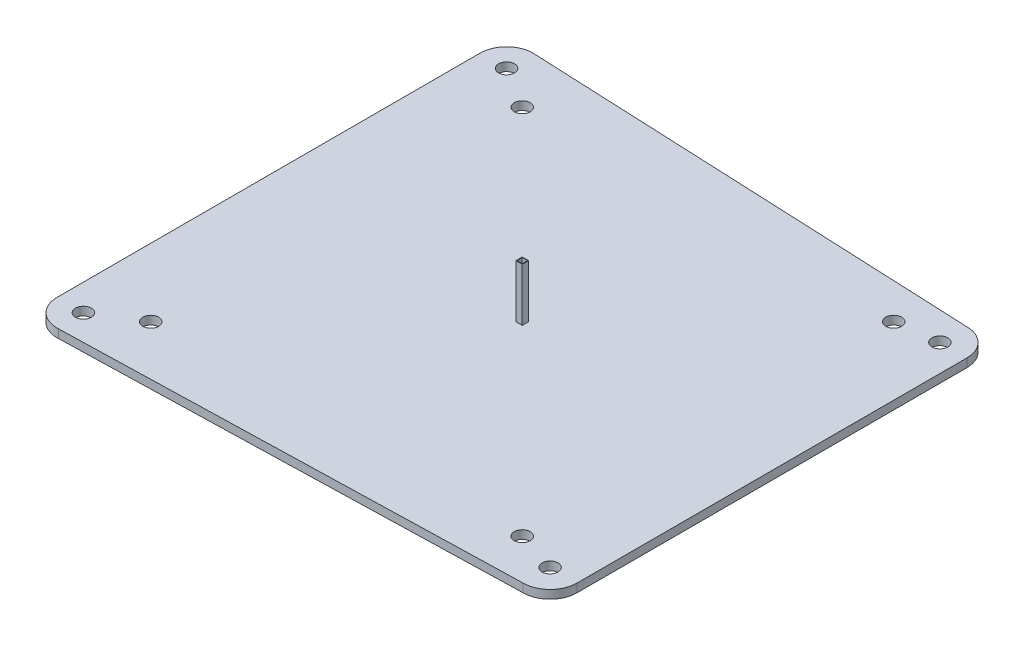
ISO-10303-21;
HEADER;
FILE_DESCRIPTION(('STEP AP214'),'2;1');
FILE_NAME('part.step','',(''),(''),'','','');
FILE_SCHEMA(('AUTOMOTIVE_DESIGN { 1 0 10303 214 1 1 1 1 }'));
ENDSEC;
DATA;
#1=APPLICATION_CONTEXT('core data for automotive mechanical design processes');
#2=APPLICATION_PROTOCOL_DEFINITION('international standard','automotive_design',2000,#1);
#3=PRODUCT_CONTEXT('',#1,'mechanical');
#4=PRODUCT('Part','Part','',(#3));
#5=PRODUCT_RELATED_PRODUCT_CATEGORY('part','',(#4));
#6=PRODUCT_DEFINITION_FORMATION('','',#4);
#7=PRODUCT_DEFINITION_CONTEXT('part definition',#1,'design');
#8=PRODUCT_DEFINITION('design','',#6,#7);
#9=PRODUCT_DEFINITION_SHAPE('','',#8);
#10=(LENGTH_UNIT() NAMED_UNIT(*) SI_UNIT(.MILLI.,.METRE.));
#11=(NAMED_UNIT(*) PLANE_ANGLE_UNIT() SI_UNIT($,.RADIAN.));
#12=(NAMED_UNIT(*) SI_UNIT($,.STERADIAN.) SOLID_ANGLE_UNIT());
#13=UNCERTAINTY_MEASURE_WITH_UNIT(LENGTH_MEASURE(1.E-05),#10,'distance_accuracy_value','');
#14=(GEOMETRIC_REPRESENTATION_CONTEXT(3) GLOBAL_UNCERTAINTY_ASSIGNED_CONTEXT((#13)) GLOBAL_UNIT_ASSIGNED_CONTEXT((#10,
#11,#12)) REPRESENTATION_CONTEXT('',''));
#15=CARTESIAN_POINT('',(0.,0.,0.));
#16=DIRECTION('',(0.,0.,1.));
#17=DIRECTION('',(1.,0.,0.));
#18=AXIS2_PLACEMENT_3D('',#15,#16,#17);
#19=CARTESIAN_POINT('',(0.,1.6,0.));
#20=DIRECTION('',(0.,-1.,0.));
#21=DIRECTION('',(0.,0.,-1.));
#22=AXIS2_PLACEMENT_3D('',#19,#20,#21);
#23=PLANE('',#22);
#24=CARTESIAN_POINT('',(-35.1,1.6,35.1));
#25=DIRECTION('',(0.,1.,0.));
#26=DIRECTION('',(0.,0.,1.));
#27=AXIS2_PLACEMENT_3D('',#24,#25,#26);
#28=CIRCLE('',#27,1.5);
#29=CARTESIAN_POINT('',(-35.1,1.6,36.6));
#30=VERTEX_POINT('',#29);
#31=EDGE_CURVE('E228',#30,#30,#28,.T.);
#32=ORIENTED_EDGE('',*,*,#31,.F.);
#33=EDGE_LOOP('',(#32));
#34=FACE_BOUND('',#33,.T.);
#35=CARTESIAN_POINT('',(35.1,1.6,35.1));
#36=DIRECTION('',(0.,1.,0.));
#37=DIRECTION('',(0.,0.,1.));
#38=AXIS2_PLACEMENT_3D('',#35,#36,#37);
#39=CIRCLE('',#38,1.5);
#40=CARTESIAN_POINT('',(35.1,1.6,36.6));
#41=VERTEX_POINT('',#40);
#42=EDGE_CURVE('E218',#41,#41,#39,.T.);
#43=ORIENTED_EDGE('',*,*,#42,.F.);
#44=EDGE_LOOP('',(#43));
#45=FACE_BOUND('',#44,.T.);
#46=CARTESIAN_POINT('',(35.1,1.6,-35.1));
#47=DIRECTION('',(0.,1.,0.));
#48=DIRECTION('',(0.,0.,1.));
#49=AXIS2_PLACEMENT_3D('',#46,#47,#48);
#50=CIRCLE('',#49,1.5);
#51=CARTESIAN_POINT('',(35.1,1.6,-33.6));
#52=VERTEX_POINT('',#51);
#53=EDGE_CURVE('E215',#52,#52,#50,.T.);
#54=ORIENTED_EDGE('',*,*,#53,.F.);
#55=EDGE_LOOP('',(#54));
#56=FACE_BOUND('',#55,.T.);
#57=CARTESIAN_POINT('',(-35.1,1.6,-35.1));
#58=DIRECTION('',(0.,1.,0.));
#59=DIRECTION('',(0.,0.,1.));
#60=AXIS2_PLACEMENT_3D('',#57,#58,#59);
#61=CIRCLE('',#60,1.5);
#62=CARTESIAN_POINT('',(-35.1,1.6,-33.6));
#63=VERTEX_POINT('',#62);
#64=EDGE_CURVE('E212',#63,#63,#61,.T.);
#65=ORIENTED_EDGE('',*,*,#64,.F.);
#66=EDGE_LOOP('',(#65));
#67=FACE_BOUND('',#66,.T.);
#68=CARTESIAN_POINT('',(-42.945,1.6,-39.985));
#69=DIRECTION('',(0.,1.,0.));
#70=DIRECTION('',(0.,0.,1.));
#71=AXIS2_PLACEMENT_3D('',#68,#69,#70);
#72=CIRCLE('',#71,1.5);
#73=CARTESIAN_POINT('',(-42.945,1.6,-38.485));
#74=VERTEX_POINT('',#73);
#75=EDGE_CURVE('E198',#74,#74,#72,.T.);
#76=ORIENTED_EDGE('',*,*,#75,.F.);
#77=EDGE_LOOP('',(#76));
#78=FACE_BOUND('',#77,.T.);
#79=CARTESIAN_POINT('',(-42.945,1.6,39.985));
#80=DIRECTION('',(0.,1.,0.));
#81=DIRECTION('',(0.,0.,1.));
#82=AXIS2_PLACEMENT_3D('',#79,#80,#81);
#83=CIRCLE('',#82,1.5);
#84=CARTESIAN_POINT('',(-42.945,1.6,41.485));
#85=VERTEX_POINT('',#84);
#86=EDGE_CURVE('E195',#85,#85,#83,.T.);
#87=ORIENTED_EDGE('',*,*,#86,.F.);
#88=EDGE_LOOP('',(#87));
#89=FACE_BOUND('',#88,.T.);
#90=CARTESIAN_POINT('',(42.845,1.6,37.585));
#91=DIRECTION('',(0.,1.,0.));
#92=DIRECTION('',(0.,0.,1.));
#93=AXIS2_PLACEMENT_3D('',#90,#91,#92);
#94=CIRCLE('',#93,1.5);
#95=CARTESIAN_POINT('',(42.845,1.6,39.085));
#96=VERTEX_POINT('',#95);
#97=EDGE_CURVE('E191',#96,#96,#94,.T.);
#98=ORIENTED_EDGE('',*,*,#97,.F.);
#99=EDGE_LOOP('',(#98));
#100=FACE_BOUND('',#99,.T.);
#101=CARTESIAN_POINT('',(42.845,1.6,-36.085));
#102=DIRECTION('',(0.,1.,0.));
#103=DIRECTION('',(0.,0.,1.));
#104=AXIS2_PLACEMENT_3D('',#101,#102,#103);
#105=CIRCLE('',#104,1.5);
#106=CARTESIAN_POINT('',(42.845,1.6,-34.585));
#107=VERTEX_POINT('',#106);
#108=EDGE_CURVE('E187',#107,#107,#105,.T.);
#109=ORIENTED_EDGE('',*,*,#108,.F.);
#110=EDGE_LOOP('',(#109));
#111=FACE_BOUND('',#110,.T.);
#112=DIRECTION('',(0.,0.,-1.));
#113=VECTOR('',#112,1.);
#114=CARTESIAN_POINT('',(0.600000000000001,1.6,0.6));
#115=LINE('',#114,#113);
#116=CARTESIAN_POINT('',(0.600000000000001,1.6,0.6));
#117=VERTEX_POINT('',#116);
#118=CARTESIAN_POINT('',(0.600000000000001,1.6,-0.6));
#119=VERTEX_POINT('',#118);
#120=EDGE_CURVE('E284',#117,#119,#115,.T.);
#121=ORIENTED_EDGE('',*,*,#120,.F.);
#122=DIRECTION('',(1.,0.,0.));
#123=VECTOR('',#122,1.);
#124=CARTESIAN_POINT('',(-0.599999999999999,1.6,0.6));
#125=LINE('',#124,#123);
#126=CARTESIAN_POINT('',(-0.599999999999999,1.6,0.6));
#127=VERTEX_POINT('',#126);
#128=EDGE_CURVE('E289',#127,#117,#125,.T.);
#129=ORIENTED_EDGE('',*,*,#128,.F.);
#130=DIRECTION('',(0.,0.,1.));
#131=VECTOR('',#130,1.);
#132=CARTESIAN_POINT('',(-0.599999999999999,1.6,0.6));
#133=LINE('',#132,#131);
#134=CARTESIAN_POINT('',(-0.599999999999999,1.6,-0.6));
#135=VERTEX_POINT('',#134);
#136=EDGE_CURVE('E301',#135,#127,#133,.T.);
#137=ORIENTED_EDGE('',*,*,#136,.F.);
#138=DIRECTION('',(-1.,0.,0.));
#139=VECTOR('',#138,1.);
#140=CARTESIAN_POINT('',(-0.599999999999999,1.6,-0.6));
#141=LINE('',#140,#139);
#142=EDGE_CURVE('E298',#119,#135,#141,.T.);
#143=ORIENTED_EDGE('',*,*,#142,.F.);
#144=EDGE_LOOP('',(#121,#129,#137,#143));
#145=FACE_BOUND('',#144,.T.);
#146=CARTESIAN_POINT('',(-42.945,1.6,-39.985));
#147=DIRECTION('',(0.,1.,0.));
#148=DIRECTION('',(0.,0.,1.));
#149=AXIS2_PLACEMENT_3D('',#146,#147,#148);
#150=CIRCLE('',#149,5.00000000000002);
#151=CARTESIAN_POINT('',(-42.5029252724991,1.6,-44.9654186506061));
#152=VERTEX_POINT('',#151);
#153=CARTESIAN_POINT('',(-47.945,1.6,-39.985));
#154=VERTEX_POINT('',#153);
#155=EDGE_CURVE('E156',#152,#154,#150,.T.);
#156=ORIENTED_EDGE('',*,*,#155,.T.);
#157=DIRECTION('',(0.,0.,1.));
#158=VECTOR('',#157,1.);
#159=CARTESIAN_POINT('',(-47.945,1.6,45.085));
#160=LINE('',#159,#158);
#161=CARTESIAN_POINT('',(-47.945,1.6,39.985));
#162=VERTEX_POINT('',#161);
#163=EDGE_CURVE('E163',#154,#162,#160,.T.);
#164=ORIENTED_EDGE('',*,*,#163,.T.);
#165=CARTESIAN_POINT('',(-42.945,1.6,39.985));
#166=DIRECTION('',(0.,1.,0.));
#167=DIRECTION('',(0.,0.,1.));
#168=AXIS2_PLACEMENT_3D('',#165,#166,#167);
#169=CIRCLE('',#168,5.);
#170=CARTESIAN_POINT('',(-42.6770960432094,1.6,44.9778175882898));
#171=VERTEX_POINT('',#170);
#172=EDGE_CURVE('E147',#162,#171,#169,.T.);
#173=ORIENTED_EDGE('',*,*,#172,.T.);
#174=DIRECTION('',(0.999640814907525,0.,-0.0268000218473834));
#175=VECTOR('',#174,1.);
#176=CARTESIAN_POINT('',(-42.6770960432094,1.6,44.9778175882898));
#177=LINE('',#176,#175);
#178=CARTESIAN_POINT('',(42.845,1.6,42.6850000000003));
#179=VERTEX_POINT('',#178);
#180=EDGE_CURVE('E155',#171,#179,#177,.T.);
#181=ORIENTED_EDGE('',*,*,#180,.T.);
#182=CARTESIAN_POINT('',(42.845,1.6,37.585));
#183=DIRECTION('',(0.,1.,0.));
#184=DIRECTION('',(0.,0.,1.));
#185=AXIS2_PLACEMENT_3D('',#182,#183,#184);
#186=CIRCLE('',#185,5.10000000000028);
#187=CARTESIAN_POINT('',(47.9450000000003,1.6,37.585));
#188=VERTEX_POINT('',#187);
#189=EDGE_CURVE('E235',#179,#188,#186,.T.);
#190=ORIENTED_EDGE('',*,*,#189,.T.);
#191=DIRECTION('',(0.,0.,-1.));
#192=VECTOR('',#191,1.);
#193=CARTESIAN_POINT('',(47.945,1.6,45.085));
#194=LINE('',#193,#192);
#195=CARTESIAN_POINT('',(47.9450000000002,1.6,-36.085));
#196=VERTEX_POINT('',#195);
#197=EDGE_CURVE('E172',#188,#196,#194,.T.);
#198=ORIENTED_EDGE('',*,*,#197,.T.);
#199=CARTESIAN_POINT('',(42.845,1.6,-36.085));
#200=DIRECTION('',(0.,1.,0.));
#201=DIRECTION('',(0.,0.,1.));
#202=AXIS2_PLACEMENT_3D('',#199,#200,#201);
#203=CIRCLE('',#202,5.10000000000022);
#204=CARTESIAN_POINT('',(42.845,1.6,-41.1850000000002));
#205=VERTEX_POINT('',#204);
#206=EDGE_CURVE('E238',#196,#205,#203,.T.);
#207=ORIENTED_EDGE('',*,*,#206,.T.);
#208=DIRECTION('',(-0.999020452773921,0.,-0.0442508185166185));
#209=VECTOR('',#208,1.);
#210=CARTESIAN_POINT('',(-42.5029252724991,1.6,-44.9654186506061));
#211=LINE('',#210,#209);
#212=EDGE_CURVE('E241',#205,#152,#211,.T.);
#213=ORIENTED_EDGE('',*,*,#212,.T.);
#214=EDGE_LOOP('',(#156,#164,#173,#181,#190,#198,#207,#213));
#215=FACE_BOUND('',#214,.T.);
#216=ADVANCED_FACE('F34',(#34,#45,#56,#67,#78,#89,#100,#111,#145,#215),#23,.F.);
#217=CARTESIAN_POINT('',(47.945,1.6,45.085));
#218=DIRECTION('',(-1.,0.,0.));
#219=DIRECTION('',(0.,0.,1.));
#220=AXIS2_PLACEMENT_3D('',#217,#218,#219);
#221=PLANE('',#220);
#222=DIRECTION('',(0.,0.,-1.));
#223=VECTOR('',#222,1.);
#224=CARTESIAN_POINT('',(47.945,0.,45.085));
#225=LINE('',#224,#223);
#226=CARTESIAN_POINT('',(47.9450000000003,0.,37.585));
#227=VERTEX_POINT('',#226);
#228=CARTESIAN_POINT('',(47.945,0.,-36.085));
#229=VERTEX_POINT('',#228);
#230=EDGE_CURVE('E180',#227,#229,#225,.T.);
#231=ORIENTED_EDGE('',*,*,#230,.T.);
#232=DIRECTION('',(0.,1.,0.));
#233=VECTOR('',#232,1.);
#234=CARTESIAN_POINT('',(47.9450000000002,-8.4,-36.085));
#235=LINE('',#234,#233);
#236=EDGE_CURVE('E59',#229,#196,#235,.T.);
#237=ORIENTED_EDGE('',*,*,#236,.T.);
#238=ORIENTED_EDGE('',*,*,#197,.F.);
#239=DIRECTION('',(0.,1.,0.));
#240=VECTOR('',#239,1.);
#241=CARTESIAN_POINT('',(47.9450000000003,-8.4,37.585));
#242=LINE('',#241,#240);
#243=EDGE_CURVE('E249',#227,#188,#242,.T.);
#244=ORIENTED_EDGE('',*,*,#243,.F.);
#245=EDGE_LOOP('',(#231,#237,#238,#244));
#246=FACE_BOUND('',#245,.T.);
#247=ADVANCED_FACE('F36',(#246),#221,.F.);
#248=CARTESIAN_POINT('',(-47.945,1.6,45.085));
#249=DIRECTION('',(1.,0.,0.));
#250=DIRECTION('',(0.,0.,-1.));
#251=AXIS2_PLACEMENT_3D('',#248,#249,#250);
#252=PLANE('',#251);
#253=DIRECTION('',(0.,1.,0.));
#254=VECTOR('',#253,1.);
#255=CARTESIAN_POINT('',(-47.945,-8.4,-39.985));
#256=LINE('',#255,#254);
#257=CARTESIAN_POINT('',(-47.945,0.,-39.985));
#258=VERTEX_POINT('',#257);
#259=EDGE_CURVE('E166',#258,#154,#256,.T.);
#260=ORIENTED_EDGE('',*,*,#259,.F.);
#261=DIRECTION('',(0.,0.,1.));
#262=VECTOR('',#261,1.);
#263=CARTESIAN_POINT('',(-47.945,0.,45.085));
#264=LINE('',#263,#262);
#265=CARTESIAN_POINT('',(-47.945,0.,39.985));
#266=VERTEX_POINT('',#265);
#267=EDGE_CURVE('E165',#258,#266,#264,.T.);
#268=ORIENTED_EDGE('',*,*,#267,.T.);
#269=DIRECTION('',(0.,1.,0.));
#270=VECTOR('',#269,1.);
#271=CARTESIAN_POINT('',(-47.945,-8.4,39.985));
#272=LINE('',#271,#270);
#273=EDGE_CURVE('E51',#266,#162,#272,.T.);
#274=ORIENTED_EDGE('',*,*,#273,.T.);
#275=ORIENTED_EDGE('',*,*,#163,.F.);
#276=EDGE_LOOP('',(#260,#268,#274,#275));
#277=FACE_BOUND('',#276,.T.);
#278=ADVANCED_FACE('F162',(#277),#252,.F.);
#279=CARTESIAN_POINT('',(0.,0.,0.));
#280=DIRECTION('',(0.,-1.,0.));
#281=DIRECTION('',(0.,0.,-1.));
#282=AXIS2_PLACEMENT_3D('',#279,#280,#281);
#283=PLANE('',#282);
#284=CARTESIAN_POINT('',(-35.1,0.,35.1));
#285=DIRECTION('',(0.,-1.,0.));
#286=DIRECTION('',(0.,0.,-1.));
#287=AXIS2_PLACEMENT_3D('',#284,#285,#286);
#288=CIRCLE('',#287,1.5);
#289=CARTESIAN_POINT('',(-35.1,0.,33.6));
#290=VERTEX_POINT('',#289);
#291=EDGE_CURVE('E38',#290,#290,#288,.T.);
#292=ORIENTED_EDGE('',*,*,#291,.F.);
#293=EDGE_LOOP('',(#292));
#294=FACE_BOUND('',#293,.T.);
#295=CARTESIAN_POINT('',(35.1,0.,35.1));
#296=DIRECTION('',(0.,-1.,0.));
#297=DIRECTION('',(0.,0.,-1.));
#298=AXIS2_PLACEMENT_3D('',#295,#296,#297);
#299=CIRCLE('',#298,1.5);
#300=CARTESIAN_POINT('',(35.1,0.,33.6));
#301=VERTEX_POINT('',#300);
#302=EDGE_CURVE('E216',#301,#301,#299,.T.);
#303=ORIENTED_EDGE('',*,*,#302,.F.);
#304=EDGE_LOOP('',(#303));
#305=FACE_BOUND('',#304,.T.);
#306=CARTESIAN_POINT('',(35.1,0.,-35.1));
#307=DIRECTION('',(0.,-1.,0.));
#308=DIRECTION('',(0.,0.,-1.));
#309=AXIS2_PLACEMENT_3D('',#306,#307,#308);
#310=CIRCLE('',#309,1.5);
#311=CARTESIAN_POINT('',(35.1,0.,-36.6));
#312=VERTEX_POINT('',#311);
#313=EDGE_CURVE('E213',#312,#312,#310,.T.);
#314=ORIENTED_EDGE('',*,*,#313,.F.);
#315=EDGE_LOOP('',(#314));
#316=FACE_BOUND('',#315,.T.);
#317=CARTESIAN_POINT('',(-35.1,0.,-35.1));
#318=DIRECTION('',(0.,-1.,0.));
#319=DIRECTION('',(0.,0.,-1.));
#320=AXIS2_PLACEMENT_3D('',#317,#318,#319);
#321=CIRCLE('',#320,1.5);
#322=CARTESIAN_POINT('',(-35.1,0.,-36.6));
#323=VERTEX_POINT('',#322);
#324=EDGE_CURVE('E209',#323,#323,#321,.T.);
#325=ORIENTED_EDGE('',*,*,#324,.F.);
#326=EDGE_LOOP('',(#325));
#327=FACE_BOUND('',#326,.T.);
#328=CARTESIAN_POINT('',(-42.945,0.,-39.985));
#329=DIRECTION('',(0.,-1.,0.));
#330=DIRECTION('',(0.,0.,-1.));
#331=AXIS2_PLACEMENT_3D('',#328,#329,#330);
#332=CIRCLE('',#331,1.5);
#333=CARTESIAN_POINT('',(-42.945,0.,-41.485));
#334=VERTEX_POINT('',#333);
#335=EDGE_CURVE('E196',#334,#334,#332,.T.);
#336=ORIENTED_EDGE('',*,*,#335,.F.);
#337=EDGE_LOOP('',(#336));
#338=FACE_BOUND('',#337,.T.);
#339=CARTESIAN_POINT('',(-42.945,0.,39.985));
#340=DIRECTION('',(0.,-1.,0.));
#341=DIRECTION('',(0.,0.,-1.));
#342=AXIS2_PLACEMENT_3D('',#339,#340,#341);
#343=CIRCLE('',#342,1.5);
#344=CARTESIAN_POINT('',(-42.945,0.,38.485));
#345=VERTEX_POINT('',#344);
#346=EDGE_CURVE('E192',#345,#345,#343,.T.);
#347=ORIENTED_EDGE('',*,*,#346,.F.);
#348=EDGE_LOOP('',(#347));
#349=FACE_BOUND('',#348,.T.);
#350=CARTESIAN_POINT('',(42.845,0.,37.585));
#351=DIRECTION('',(0.,-1.,0.));
#352=DIRECTION('',(0.,0.,-1.));
#353=AXIS2_PLACEMENT_3D('',#350,#351,#352);
#354=CIRCLE('',#353,1.5);
#355=CARTESIAN_POINT('',(42.845,0.,36.085));
#356=VERTEX_POINT('',#355);
#357=EDGE_CURVE('E188',#356,#356,#354,.T.);
#358=ORIENTED_EDGE('',*,*,#357,.F.);
#359=EDGE_LOOP('',(#358));
#360=FACE_BOUND('',#359,.T.);
#361=CARTESIAN_POINT('',(42.845,0.,-36.085));
#362=DIRECTION('',(0.,-1.,0.));
#363=DIRECTION('',(0.,0.,-1.));
#364=AXIS2_PLACEMENT_3D('',#361,#362,#363);
#365=CIRCLE('',#364,1.5);
#366=CARTESIAN_POINT('',(42.845,0.,-37.585));
#367=VERTEX_POINT('',#366);
#368=EDGE_CURVE('E183',#367,#367,#365,.T.);
#369=ORIENTED_EDGE('',*,*,#368,.F.);
#370=EDGE_LOOP('',(#369));
#371=FACE_BOUND('',#370,.T.);
#372=ORIENTED_EDGE('',*,*,#267,.F.);
#373=CARTESIAN_POINT('',(-42.945,0.,-39.985));
#374=DIRECTION('',(0.,-1.,0.));
#375=DIRECTION('',(0.,0.,-1.));
#376=AXIS2_PLACEMENT_3D('',#373,#374,#375);
#377=CIRCLE('',#376,5.00000000000002);
#378=CARTESIAN_POINT('',(-42.5029252724991,0.,-44.9654186506061));
#379=VERTEX_POINT('',#378);
#380=EDGE_CURVE('E12',#258,#379,#377,.T.);
#381=ORIENTED_EDGE('',*,*,#380,.T.);
#382=DIRECTION('',(0.999020452773921,0.,0.0442508185166185));
#383=VECTOR('',#382,1.);
#384=CARTESIAN_POINT('',(1.90458105669061,0.,-42.998423382499));
#385=LINE('',#384,#383);
#386=CARTESIAN_POINT('',(42.845,0.,-41.1850000000002));
#387=VERTEX_POINT('',#386);
#388=EDGE_CURVE('E43',#379,#387,#385,.T.);
#389=ORIENTED_EDGE('',*,*,#388,.T.);
#390=CARTESIAN_POINT('',(42.845,0.,-36.085));
#391=DIRECTION('',(0.,-1.,0.));
#392=DIRECTION('',(0.,0.,-1.));
#393=AXIS2_PLACEMENT_3D('',#390,#391,#392);
#394=CIRCLE('',#393,5.10000000000022);
#395=EDGE_CURVE('E205',#387,#229,#394,.T.);
#396=ORIENTED_EDGE('',*,*,#395,.T.);
#397=ORIENTED_EDGE('',*,*,#230,.F.);
#398=CARTESIAN_POINT('',(42.845,0.,37.585));
#399=DIRECTION('',(0.,-1.,0.));
#400=DIRECTION('',(0.,0.,-1.));
#401=AXIS2_PLACEMENT_3D('',#398,#399,#400);
#402=CIRCLE('',#401,5.10000000000028);
#403=CARTESIAN_POINT('',(42.845,0.,42.6850000000003));
#404=VERTEX_POINT('',#403);
#405=EDGE_CURVE('E202',#227,#404,#402,.T.);
#406=ORIENTED_EDGE('',*,*,#405,.T.);
#407=DIRECTION('',(-0.999640814907525,0.,0.0268000218473834));
#408=VECTOR('',#407,1.);
#409=CARTESIAN_POINT('',(1.17432108253295,0.,43.8021763784845));
#410=LINE('',#409,#408);
#411=CARTESIAN_POINT('',(-42.6770960432094,0.,44.9778175882898));
#412=VERTEX_POINT('',#411);
#413=EDGE_CURVE('E174',#404,#412,#410,.T.);
#414=ORIENTED_EDGE('',*,*,#413,.T.);
#415=CARTESIAN_POINT('',(-42.945,0.,39.985));
#416=DIRECTION('',(0.,-1.,0.));
#417=DIRECTION('',(0.,0.,-1.));
#418=AXIS2_PLACEMENT_3D('',#415,#416,#417);
#419=CIRCLE('',#418,5.);
#420=EDGE_CURVE('E171',#412,#266,#419,.T.);
#421=ORIENTED_EDGE('',*,*,#420,.T.);
#422=EDGE_LOOP('',(#372,#381,#389,#396,#397,#406,#414,#421));
#423=FACE_BOUND('',#422,.T.);
#424=ADVANCED_FACE('F373',(#294,#305,#316,#327,#338,#349,#360,#371,#423),#283,.T.);
#425=CARTESIAN_POINT('',(42.845,-8.4,-36.085));
#426=DIRECTION('',(0.,1.,0.));
#427=DIRECTION('',(0.,0.,1.));
#428=AXIS2_PLACEMENT_3D('',#425,#426,#427);
#429=CYLINDRICAL_SURFACE('',#428,1.5);
#430=ORIENTED_EDGE('',*,*,#368,.T.);
#431=EDGE_LOOP('',(#430));
#432=FACE_BOUND('',#431,.T.);
#433=ORIENTED_EDGE('',*,*,#108,.T.);
#434=EDGE_LOOP('',(#433));
#435=FACE_BOUND('',#434,.T.);
#436=ADVANCED_FACE('F325',(#432,#435),#429,.F.);
#437=CARTESIAN_POINT('',(42.845,-8.4,37.585));
#438=DIRECTION('',(0.,1.,0.));
#439=DIRECTION('',(0.,0.,1.));
#440=AXIS2_PLACEMENT_3D('',#437,#438,#439);
#441=CYLINDRICAL_SURFACE('',#440,1.5);
#442=ORIENTED_EDGE('',*,*,#357,.T.);
#443=EDGE_LOOP('',(#442));
#444=FACE_BOUND('',#443,.T.);
#445=ORIENTED_EDGE('',*,*,#97,.T.);
#446=EDGE_LOOP('',(#445));
#447=FACE_BOUND('',#446,.T.);
#448=ADVANCED_FACE('F367',(#444,#447),#441,.F.);
#449=CARTESIAN_POINT('',(-42.945,-8.4,39.985));
#450=DIRECTION('',(0.,1.,0.));
#451=DIRECTION('',(0.,0.,1.));
#452=AXIS2_PLACEMENT_3D('',#449,#450,#451);
#453=CYLINDRICAL_SURFACE('',#452,1.5);
#454=ORIENTED_EDGE('',*,*,#346,.T.);
#455=EDGE_LOOP('',(#454));
#456=FACE_BOUND('',#455,.T.);
#457=ORIENTED_EDGE('',*,*,#86,.T.);
#458=EDGE_LOOP('',(#457));
#459=FACE_BOUND('',#458,.T.);
#460=ADVANCED_FACE('F363',(#456,#459),#453,.F.);
#461=CARTESIAN_POINT('',(-42.945,-8.4,-39.985));
#462=DIRECTION('',(0.,1.,0.));
#463=DIRECTION('',(0.,0.,1.));
#464=AXIS2_PLACEMENT_3D('',#461,#462,#463);
#465=CYLINDRICAL_SURFACE('',#464,1.5);
#466=ORIENTED_EDGE('',*,*,#335,.T.);
#467=EDGE_LOOP('',(#466));
#468=FACE_BOUND('',#467,.T.);
#469=ORIENTED_EDGE('',*,*,#75,.T.);
#470=EDGE_LOOP('',(#469));
#471=FACE_BOUND('',#470,.T.);
#472=ADVANCED_FACE('F360',(#468,#471),#465,.F.);
#473=CARTESIAN_POINT('',(0.,11.6,0.));
#474=DIRECTION('',(0.,-1.,0.));
#475=DIRECTION('',(0.,0.,-1.));
#476=AXIS2_PLACEMENT_3D('',#473,#474,#475);
#477=PLANE('',#476);
#478=DIRECTION('',(0.,0.,-1.));
#479=VECTOR('',#478,1.);
#480=CARTESIAN_POINT('',(0.600000000000001,11.6,0.6));
#481=LINE('',#480,#479);
#482=CARTESIAN_POINT('',(0.600000000000001,11.6,0.6));
#483=VERTEX_POINT('',#482);
#484=CARTESIAN_POINT('',(0.600000000000001,11.6,-0.6));
#485=VERTEX_POINT('',#484);
#486=EDGE_CURVE('E285',#483,#485,#481,.T.);
#487=ORIENTED_EDGE('',*,*,#486,.T.);
#488=DIRECTION('',(-1.,0.,0.));
#489=VECTOR('',#488,1.);
#490=CARTESIAN_POINT('',(-0.599999999999999,11.6,-0.6));
#491=LINE('',#490,#489);
#492=CARTESIAN_POINT('',(-0.599999999999999,11.6,-0.6));
#493=VERTEX_POINT('',#492);
#494=EDGE_CURVE('E288',#485,#493,#491,.T.);
#495=ORIENTED_EDGE('',*,*,#494,.T.);
#496=DIRECTION('',(0.,0.,1.));
#497=VECTOR('',#496,1.);
#498=CARTESIAN_POINT('',(-0.599999999999999,11.6,0.6));
#499=LINE('',#498,#497);
#500=CARTESIAN_POINT('',(-0.599999999999999,11.6,0.6));
#501=VERTEX_POINT('',#500);
#502=EDGE_CURVE('E291',#493,#501,#499,.T.);
#503=ORIENTED_EDGE('',*,*,#502,.T.);
#504=DIRECTION('',(1.,0.,0.));
#505=VECTOR('',#504,1.);
#506=CARTESIAN_POINT('',(-0.599999999999999,11.6,0.6));
#507=LINE('',#506,#505);
#508=EDGE_CURVE('E293',#501,#483,#507,.T.);
#509=ORIENTED_EDGE('',*,*,#508,.T.);
#510=EDGE_LOOP('',(#487,#495,#503,#509));
#511=FACE_BOUND('',#510,.T.);
#512=DIRECTION('',(0.,0.,-1.));
#513=VECTOR('',#512,1.);
#514=CARTESIAN_POINT('',(0.5,11.6,0.5));
#515=LINE('',#514,#513);
#516=CARTESIAN_POINT('',(0.5,11.6,0.5));
#517=VERTEX_POINT('',#516);
#518=CARTESIAN_POINT('',(0.5,11.6,-0.5));
#519=VERTEX_POINT('',#518);
#520=EDGE_CURVE('E255',#517,#519,#515,.T.);
#521=ORIENTED_EDGE('',*,*,#520,.F.);
#522=DIRECTION('',(1.,0.,0.));
#523=VECTOR('',#522,1.);
#524=CARTESIAN_POINT('',(-0.5,11.6,0.5));
#525=LINE('',#524,#523);
#526=CARTESIAN_POINT('',(-0.5,11.6,0.5));
#527=VERTEX_POINT('',#526);
#528=EDGE_CURVE('E263',#527,#517,#525,.T.);
#529=ORIENTED_EDGE('',*,*,#528,.F.);
#530=DIRECTION('',(0.,0.,1.));
#531=VECTOR('',#530,1.);
#532=CARTESIAN_POINT('',(-0.5,11.6,0.5));
#533=LINE('',#532,#531);
#534=CARTESIAN_POINT('',(-0.5,11.6,-0.5));
#535=VERTEX_POINT('',#534);
#536=EDGE_CURVE('E260',#535,#527,#533,.T.);
#537=ORIENTED_EDGE('',*,*,#536,.F.);
#538=DIRECTION('',(-1.,0.,0.));
#539=VECTOR('',#538,1.);
#540=CARTESIAN_POINT('',(-0.5,11.6,-0.5));
#541=LINE('',#540,#539);
#542=EDGE_CURVE('E257',#519,#535,#541,.T.);
#543=ORIENTED_EDGE('',*,*,#542,.F.);
#544=EDGE_LOOP('',(#521,#529,#537,#543));
#545=FACE_BOUND('',#544,.T.);
#546=ADVANCED_FACE('F342',(#511,#545),#477,.F.);
#547=CARTESIAN_POINT('',(0.600000000000001,11.6,0.6));
#548=DIRECTION('',(-1.,0.,0.));
#549=DIRECTION('',(0.,0.,1.));
#550=AXIS2_PLACEMENT_3D('',#547,#548,#549);
#551=PLANE('',#550);
#552=ORIENTED_EDGE('',*,*,#120,.T.);
#553=DIRECTION('',(0.,-1.,0.));
#554=VECTOR('',#553,1.);
#555=CARTESIAN_POINT('',(0.600000000000001,11.6,-0.6));
#556=LINE('',#555,#554);
#557=EDGE_CURVE('E314',#485,#119,#556,.T.);
#558=ORIENTED_EDGE('',*,*,#557,.F.);
#559=ORIENTED_EDGE('',*,*,#486,.F.);
#560=DIRECTION('',(0.,-1.,0.));
#561=VECTOR('',#560,1.);
#562=CARTESIAN_POINT('',(0.600000000000001,11.6,0.6));
#563=LINE('',#562,#561);
#564=EDGE_CURVE('E295',#483,#117,#563,.T.);
#565=ORIENTED_EDGE('',*,*,#564,.T.);
#566=EDGE_LOOP('',(#552,#558,#559,#565));
#567=FACE_BOUND('',#566,.T.);
#568=ADVANCED_FACE('F340',(#567),#551,.F.);
#569=CARTESIAN_POINT('',(-0.599999999999999,11.6,-0.6));
#570=DIRECTION('',(0.,0.,1.));
#571=DIRECTION('',(1.,0.,0.));
#572=AXIS2_PLACEMENT_3D('',#569,#570,#571);
#573=PLANE('',#572);
#574=ORIENTED_EDGE('',*,*,#142,.T.);
#575=DIRECTION('',(0.,-1.,0.));
#576=VECTOR('',#575,1.);
#577=CARTESIAN_POINT('',(-0.599999999999999,11.6,-0.6));
#578=LINE('',#577,#576);
#579=EDGE_CURVE('E311',#493,#135,#578,.T.);
#580=ORIENTED_EDGE('',*,*,#579,.F.);
#581=ORIENTED_EDGE('',*,*,#494,.F.);
#582=ORIENTED_EDGE('',*,*,#557,.T.);
#583=EDGE_LOOP('',(#574,#580,#581,#582));
#584=FACE_BOUND('',#583,.T.);
#585=ADVANCED_FACE('F349',(#584),#573,.F.);
#586=CARTESIAN_POINT('',(-0.599999999999999,11.6,0.6));
#587=DIRECTION('',(1.,0.,0.));
#588=DIRECTION('',(0.,0.,-1.));
#589=AXIS2_PLACEMENT_3D('',#586,#587,#588);
#590=PLANE('',#589);
#591=ORIENTED_EDGE('',*,*,#136,.T.);
#592=DIRECTION('',(0.,-1.,0.));
#593=VECTOR('',#592,1.);
#594=CARTESIAN_POINT('',(-0.599999999999999,11.6,0.6));
#595=LINE('',#594,#593);
#596=EDGE_CURVE('E308',#501,#127,#595,.T.);
#597=ORIENTED_EDGE('',*,*,#596,.F.);
#598=ORIENTED_EDGE('',*,*,#502,.F.);
#599=ORIENTED_EDGE('',*,*,#579,.T.);
#600=EDGE_LOOP('',(#591,#597,#598,#599));
#601=FACE_BOUND('',#600,.T.);
#602=ADVANCED_FACE('F347',(#601),#590,.F.);
#603=CARTESIAN_POINT('',(-0.599999999999999,11.6,0.6));
#604=DIRECTION('',(0.,0.,-1.));
#605=DIRECTION('',(-1.,0.,0.));
#606=AXIS2_PLACEMENT_3D('',#603,#604,#605);
#607=PLANE('',#606);
#608=ORIENTED_EDGE('',*,*,#128,.T.);
#609=ORIENTED_EDGE('',*,*,#564,.F.);
#610=ORIENTED_EDGE('',*,*,#508,.F.);
#611=ORIENTED_EDGE('',*,*,#596,.T.);
#612=EDGE_LOOP('',(#608,#609,#610,#611));
#613=FACE_BOUND('',#612,.T.);
#614=ADVANCED_FACE('F336',(#613),#607,.F.);
#615=CARTESIAN_POINT('',(0.5,11.6,0.5));
#616=DIRECTION('',(-1.,0.,0.));
#617=DIRECTION('',(0.,0.,1.));
#618=AXIS2_PLACEMENT_3D('',#615,#616,#617);
#619=PLANE('',#618);
#620=DIRECTION('',(0.,0.,-1.));
#621=VECTOR('',#620,1.);
#622=CARTESIAN_POINT('',(0.5,1.6,0.5));
#623=LINE('',#622,#621);
#624=CARTESIAN_POINT('',(0.5,1.6,0.5));
#625=VERTEX_POINT('',#624);
#626=CARTESIAN_POINT('',(0.5,1.6,-0.5));
#627=VERTEX_POINT('',#626);
#628=EDGE_CURVE('E245',#625,#627,#623,.T.);
#629=ORIENTED_EDGE('',*,*,#628,.F.);
#630=DIRECTION('',(0.,-1.,0.));
#631=VECTOR('',#630,1.);
#632=CARTESIAN_POINT('',(0.5,11.6,0.5));
#633=LINE('',#632,#631);
#634=EDGE_CURVE('E265',#517,#625,#633,.T.);
#635=ORIENTED_EDGE('',*,*,#634,.F.);
#636=ORIENTED_EDGE('',*,*,#520,.T.);
#637=DIRECTION('',(0.,-1.,0.));
#638=VECTOR('',#637,1.);
#639=CARTESIAN_POINT('',(0.5,11.6,-0.5));
#640=LINE('',#639,#638);
#641=EDGE_CURVE('E281',#519,#627,#640,.T.);
#642=ORIENTED_EDGE('',*,*,#641,.T.);
#643=EDGE_LOOP('',(#629,#635,#636,#642));
#644=FACE_BOUND('',#643,.T.);
#645=ADVANCED_FACE('F429',(#644),#619,.T.);
#646=CARTESIAN_POINT('',(-0.5,11.6,-0.5));
#647=DIRECTION('',(0.,0.,1.));
#648=DIRECTION('',(1.,0.,0.));
#649=AXIS2_PLACEMENT_3D('',#646,#647,#648);
#650=PLANE('',#649);
#651=DIRECTION('',(-1.,0.,0.));
#652=VECTOR('',#651,1.);
#653=CARTESIAN_POINT('',(-0.5,1.6,-0.5));
#654=LINE('',#653,#652);
#655=CARTESIAN_POINT('',(-0.5,1.6,-0.5));
#656=VERTEX_POINT('',#655);
#657=EDGE_CURVE('E268',#627,#656,#654,.T.);
#658=ORIENTED_EDGE('',*,*,#657,.F.);
#659=ORIENTED_EDGE('',*,*,#641,.F.);
#660=ORIENTED_EDGE('',*,*,#542,.T.);
#661=DIRECTION('',(0.,-1.,0.));
#662=VECTOR('',#661,1.);
#663=CARTESIAN_POINT('',(-0.5,11.6,-0.5));
#664=LINE('',#663,#662);
#665=EDGE_CURVE('E279',#535,#656,#664,.T.);
#666=ORIENTED_EDGE('',*,*,#665,.T.);
#667=EDGE_LOOP('',(#658,#659,#660,#666));
#668=FACE_BOUND('',#667,.T.);
#669=ADVANCED_FACE('F425',(#668),#650,.T.);
#670=CARTESIAN_POINT('',(-0.5,11.6,0.5));
#671=DIRECTION('',(1.,0.,0.));
#672=DIRECTION('',(0.,0.,-1.));
#673=AXIS2_PLACEMENT_3D('',#670,#671,#672);
#674=PLANE('',#673);
#675=DIRECTION('',(0.,0.,1.));
#676=VECTOR('',#675,1.);
#677=CARTESIAN_POINT('',(-0.5,1.6,0.5));
#678=LINE('',#677,#676);
#679=CARTESIAN_POINT('',(-0.5,1.6,0.5));
#680=VERTEX_POINT('',#679);
#681=EDGE_CURVE('E271',#656,#680,#678,.T.);
#682=ORIENTED_EDGE('',*,*,#681,.F.);
#683=ORIENTED_EDGE('',*,*,#665,.F.);
#684=ORIENTED_EDGE('',*,*,#536,.T.);
#685=DIRECTION('',(0.,-1.,0.));
#686=VECTOR('',#685,1.);
#687=CARTESIAN_POINT('',(-0.5,11.6,0.5));
#688=LINE('',#687,#686);
#689=EDGE_CURVE('E277',#527,#680,#688,.T.);
#690=ORIENTED_EDGE('',*,*,#689,.T.);
#691=EDGE_LOOP('',(#682,#683,#684,#690));
#692=FACE_BOUND('',#691,.T.);
#693=ADVANCED_FACE('F421',(#692),#674,.T.);
#694=CARTESIAN_POINT('',(-0.5,11.6,0.5));
#695=DIRECTION('',(0.,0.,-1.));
#696=DIRECTION('',(-1.,0.,0.));
#697=AXIS2_PLACEMENT_3D('',#694,#695,#696);
#698=PLANE('',#697);
#699=DIRECTION('',(1.,0.,0.));
#700=VECTOR('',#699,1.);
#701=CARTESIAN_POINT('',(-0.5,1.6,0.5));
#702=LINE('',#701,#700);
#703=EDGE_CURVE('E258',#680,#625,#702,.T.);
#704=ORIENTED_EDGE('',*,*,#703,.F.);
#705=ORIENTED_EDGE('',*,*,#689,.F.);
#706=ORIENTED_EDGE('',*,*,#528,.T.);
#707=ORIENTED_EDGE('',*,*,#634,.T.);
#708=EDGE_LOOP('',(#704,#705,#706,#707));
#709=FACE_BOUND('',#708,.T.);
#710=ADVANCED_FACE('F377',(#709),#698,.T.);
#711=ORIENTED_EDGE('',*,*,#703,.T.);
#712=ORIENTED_EDGE('',*,*,#628,.T.);
#713=ORIENTED_EDGE('',*,*,#657,.T.);
#714=ORIENTED_EDGE('',*,*,#681,.T.);
#715=EDGE_LOOP('',(#711,#712,#713,#714));
#716=FACE_BOUND('',#715,.T.);
#717=ADVANCED_FACE('F331',(#716),#23,.F.);
#718=CARTESIAN_POINT('',(-42.945,-8.4,39.985));
#719=DIRECTION('',(0.,1.,0.));
#720=DIRECTION('',(0.,0.,1.));
#721=AXIS2_PLACEMENT_3D('',#718,#719,#720);
#722=CYLINDRICAL_SURFACE('',#721,5.);
#723=DIRECTION('',(0.,1.,0.));
#724=VECTOR('',#723,1.);
#725=CARTESIAN_POINT('',(-42.6770960432094,-8.4,44.9778175882898));
#726=LINE('',#725,#724);
#727=EDGE_CURVE('E150',#412,#171,#726,.T.);
#728=ORIENTED_EDGE('',*,*,#727,.T.);
#729=ORIENTED_EDGE('',*,*,#172,.F.);
#730=ORIENTED_EDGE('',*,*,#273,.F.);
#731=ORIENTED_EDGE('',*,*,#420,.F.);
#732=EDGE_LOOP('',(#728,#729,#730,#731));
#733=FACE_BOUND('',#732,.T.);
#734=ADVANCED_FACE('F148',(#733),#722,.T.);
#735=CARTESIAN_POINT('',(-42.6770960432094,-8.4,44.9778175882898));
#736=DIRECTION('',(0.0268000218473834,0.,0.999640814907525));
#737=DIRECTION('',(0.999640814907525,0.,-0.0268000218473834));
#738=AXIS2_PLACEMENT_3D('',#735,#736,#737);
#739=PLANE('',#738);
#740=DIRECTION('',(0.,1.,0.));
#741=VECTOR('',#740,1.);
#742=CARTESIAN_POINT('',(42.845,-8.4,42.6850000000003));
#743=LINE('',#742,#741);
#744=EDGE_CURVE('E251',#404,#179,#743,.T.);
#745=ORIENTED_EDGE('',*,*,#744,.T.);
#746=ORIENTED_EDGE('',*,*,#180,.F.);
#747=ORIENTED_EDGE('',*,*,#727,.F.);
#748=ORIENTED_EDGE('',*,*,#413,.F.);
#749=EDGE_LOOP('',(#745,#746,#747,#748));
#750=FACE_BOUND('',#749,.T.);
#751=ADVANCED_FACE('F405',(#750),#739,.T.);
#752=CARTESIAN_POINT('',(42.845,-8.4,37.585));
#753=DIRECTION('',(0.,1.,0.));
#754=DIRECTION('',(0.,0.,1.));
#755=AXIS2_PLACEMENT_3D('',#752,#753,#754);
#756=CYLINDRICAL_SURFACE('',#755,5.10000000000028);
#757=ORIENTED_EDGE('',*,*,#243,.T.);
#758=ORIENTED_EDGE('',*,*,#189,.F.);
#759=ORIENTED_EDGE('',*,*,#744,.F.);
#760=ORIENTED_EDGE('',*,*,#405,.F.);
#761=EDGE_LOOP('',(#757,#758,#759,#760));
#762=FACE_BOUND('',#761,.T.);
#763=ADVANCED_FACE('F403',(#762),#756,.T.);
#764=CARTESIAN_POINT('',(-42.945,-8.4,-39.985));
#765=DIRECTION('',(0.,1.,0.));
#766=DIRECTION('',(0.,0.,1.));
#767=AXIS2_PLACEMENT_3D('',#764,#765,#766);
#768=CYLINDRICAL_SURFACE('',#767,5.00000000000002);
#769=ORIENTED_EDGE('',*,*,#259,.T.);
#770=ORIENTED_EDGE('',*,*,#155,.F.);
#771=DIRECTION('',(0.,1.,0.));
#772=VECTOR('',#771,1.);
#773=CARTESIAN_POINT('',(-42.5029252724991,-8.4,-44.9654186506061));
#774=LINE('',#773,#772);
#775=EDGE_CURVE('E243',#379,#152,#774,.T.);
#776=ORIENTED_EDGE('',*,*,#775,.F.);
#777=ORIENTED_EDGE('',*,*,#380,.F.);
#778=EDGE_LOOP('',(#769,#770,#776,#777));
#779=FACE_BOUND('',#778,.T.);
#780=ADVANCED_FACE('F407',(#779),#768,.T.);
#781=CARTESIAN_POINT('',(-42.5029252724991,-8.4,-44.9654186506061));
#782=DIRECTION('',(0.0442508185166185,0.,-0.999020452773921));
#783=DIRECTION('',(-0.999020452773921,0.,-0.0442508185166185));
#784=AXIS2_PLACEMENT_3D('',#781,#782,#783);
#785=PLANE('',#784);
#786=ORIENTED_EDGE('',*,*,#775,.T.);
#787=ORIENTED_EDGE('',*,*,#212,.F.);
#788=DIRECTION('',(0.,1.,0.));
#789=VECTOR('',#788,1.);
#790=CARTESIAN_POINT('',(42.845,-8.4,-41.1850000000002));
#791=LINE('',#790,#789);
#792=EDGE_CURVE('E246',#387,#205,#791,.T.);
#793=ORIENTED_EDGE('',*,*,#792,.F.);
#794=ORIENTED_EDGE('',*,*,#388,.F.);
#795=EDGE_LOOP('',(#786,#787,#793,#794));
#796=FACE_BOUND('',#795,.T.);
#797=ADVANCED_FACE('F398',(#796),#785,.T.);
#798=CARTESIAN_POINT('',(42.845,-8.4,-36.085));
#799=DIRECTION('',(0.,1.,0.));
#800=DIRECTION('',(0.,0.,1.));
#801=AXIS2_PLACEMENT_3D('',#798,#799,#800);
#802=CYLINDRICAL_SURFACE('',#801,5.10000000000022);
#803=ORIENTED_EDGE('',*,*,#792,.T.);
#804=ORIENTED_EDGE('',*,*,#206,.F.);
#805=ORIENTED_EDGE('',*,*,#236,.F.);
#806=ORIENTED_EDGE('',*,*,#395,.F.);
#807=EDGE_LOOP('',(#803,#804,#805,#806));
#808=FACE_BOUND('',#807,.T.);
#809=ADVANCED_FACE('F395',(#808),#802,.T.);
#810=CARTESIAN_POINT('',(-35.1,-8.4,-35.1));
#811=DIRECTION('',(0.,1.,0.));
#812=DIRECTION('',(0.,0.,1.));
#813=AXIS2_PLACEMENT_3D('',#810,#811,#812);
#814=CYLINDRICAL_SURFACE('',#813,1.5);
#815=ORIENTED_EDGE('',*,*,#324,.T.);
#816=EDGE_LOOP('',(#815));
#817=FACE_BOUND('',#816,.T.);
#818=ORIENTED_EDGE('',*,*,#64,.T.);
#819=EDGE_LOOP('',(#818));
#820=FACE_BOUND('',#819,.T.);
#821=ADVANCED_FACE('F492',(#817,#820),#814,.F.);
#822=CARTESIAN_POINT('',(35.1,-8.4,-35.1));
#823=DIRECTION('',(0.,1.,0.));
#824=DIRECTION('',(0.,0.,1.));
#825=AXIS2_PLACEMENT_3D('',#822,#823,#824);
#826=CYLINDRICAL_SURFACE('',#825,1.5);
#827=ORIENTED_EDGE('',*,*,#313,.T.);
#828=EDGE_LOOP('',(#827));
#829=FACE_BOUND('',#828,.T.);
#830=ORIENTED_EDGE('',*,*,#53,.T.);
#831=EDGE_LOOP('',(#830));
#832=FACE_BOUND('',#831,.T.);
#833=ADVANCED_FACE('F508',(#829,#832),#826,.F.);
#834=CARTESIAN_POINT('',(35.1,-8.4,35.1));
#835=DIRECTION('',(0.,1.,0.));
#836=DIRECTION('',(0.,0.,1.));
#837=AXIS2_PLACEMENT_3D('',#834,#835,#836);
#838=CYLINDRICAL_SURFACE('',#837,1.5);
#839=ORIENTED_EDGE('',*,*,#302,.T.);
#840=EDGE_LOOP('',(#839));
#841=FACE_BOUND('',#840,.T.);
#842=ORIENTED_EDGE('',*,*,#42,.T.);
#843=EDGE_LOOP('',(#842));
#844=FACE_BOUND('',#843,.T.);
#845=ADVANCED_FACE('F518',(#841,#844),#838,.F.);
#846=CARTESIAN_POINT('',(-35.1,-8.4,35.1));
#847=DIRECTION('',(0.,1.,0.));
#848=DIRECTION('',(0.,0.,1.));
#849=AXIS2_PLACEMENT_3D('',#846,#847,#848);
#850=CYLINDRICAL_SURFACE('',#849,1.5);
#851=ORIENTED_EDGE('',*,*,#291,.T.);
#852=EDGE_LOOP('',(#851));
#853=FACE_BOUND('',#852,.T.);
#854=ORIENTED_EDGE('',*,*,#31,.T.);
#855=EDGE_LOOP('',(#854));
#856=FACE_BOUND('',#855,.T.);
#857=ADVANCED_FACE('F528',(#853,#856),#850,.F.);
#858=CLOSED_SHELL('',(#216,#247,#278,#424,#436,#448,#460,#472,#546,#568,#585,#602,#614,#645,
#669,#693,#710,#717,#734,#751,#763,#780,#797,#809,#821,#833,#845,#857));
#859=MANIFOLD_SOLID_BREP('B2',#858);
#860=ADVANCED_BREP_SHAPE_REPRESENTATION('',(#18,#859),#14);
#861=SHAPE_DEFINITION_REPRESENTATION(#9,#860);
ENDSEC;
END-ISO-10303-21;
